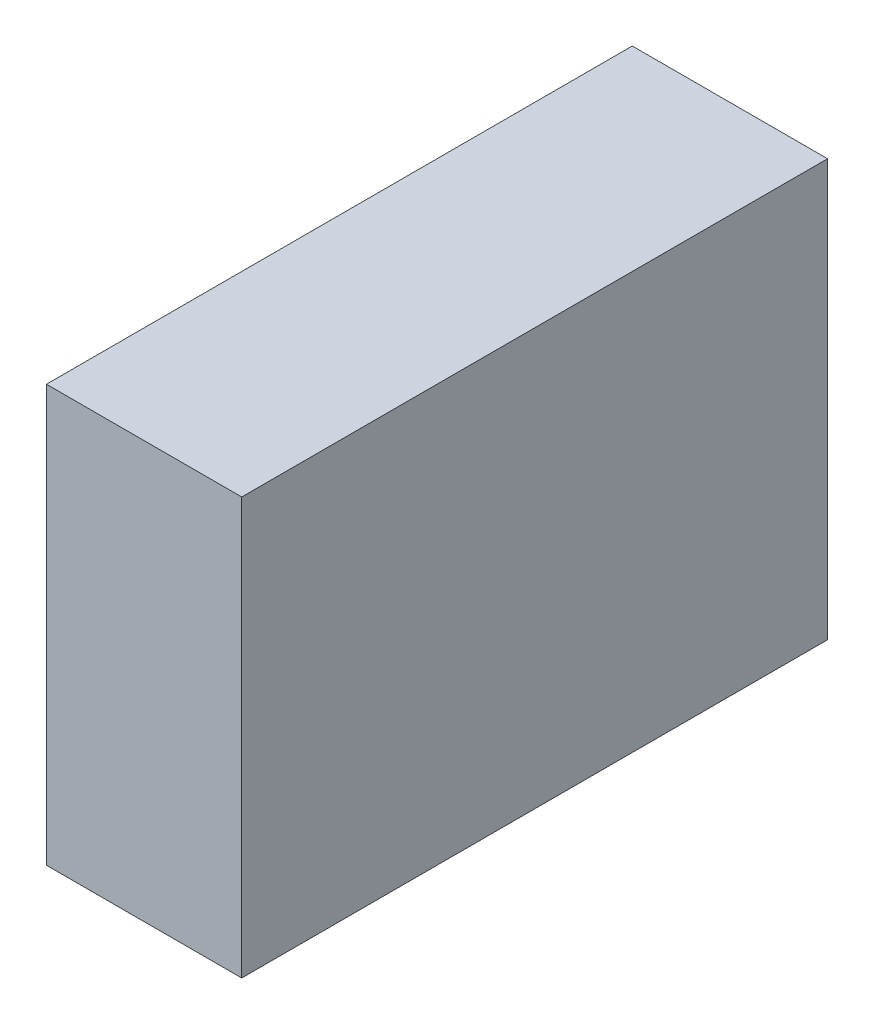
ISO-10303-21;
HEADER;
FILE_DESCRIPTION(('STEP AP214'),'2;1');
FILE_NAME('part.step','',(''),(''),'','','');
FILE_SCHEMA(('AUTOMOTIVE_DESIGN { 1 0 10303 214 1 1 1 1 }'));
ENDSEC;
DATA;
#1=APPLICATION_CONTEXT('core data for automotive mechanical design processes');
#2=APPLICATION_PROTOCOL_DEFINITION('international standard','automotive_design',2000,#1);
#3=PRODUCT_CONTEXT('',#1,'mechanical');
#4=PRODUCT('Part','Part','',(#3));
#5=PRODUCT_RELATED_PRODUCT_CATEGORY('part','',(#4));
#6=PRODUCT_DEFINITION_FORMATION('','',#4);
#7=PRODUCT_DEFINITION_CONTEXT('part definition',#1,'design');
#8=PRODUCT_DEFINITION('design','',#6,#7);
#9=PRODUCT_DEFINITION_SHAPE('','',#8);
#10=(LENGTH_UNIT() NAMED_UNIT(*) SI_UNIT(.MILLI.,.METRE.));
#11=(NAMED_UNIT(*) PLANE_ANGLE_UNIT() SI_UNIT($,.RADIAN.));
#12=(NAMED_UNIT(*) SI_UNIT($,.STERADIAN.) SOLID_ANGLE_UNIT());
#13=UNCERTAINTY_MEASURE_WITH_UNIT(LENGTH_MEASURE(1.E-05),#10,'distance_accuracy_value','');
#14=(GEOMETRIC_REPRESENTATION_CONTEXT(3) GLOBAL_UNCERTAINTY_ASSIGNED_CONTEXT((#13)) GLOBAL_UNIT_ASSIGNED_CONTEXT((#10,
#11,#12)) REPRESENTATION_CONTEXT('',''));
#15=CARTESIAN_POINT('',(0.,0.,0.));
#16=DIRECTION('',(0.,0.,1.));
#17=DIRECTION('',(1.,0.,0.));
#18=AXIS2_PLACEMENT_3D('',#15,#16,#17);
#19=CARTESIAN_POINT('',(15.,-16.,-22.5));
#20=DIRECTION('',(0.,0.,1.));
#21=DIRECTION('',(1.,0.,0.));
#22=AXIS2_PLACEMENT_3D('',#19,#20,#21);
#23=PLANE('',#22);
#24=DIRECTION('',(0.,1.,0.));
#25=VECTOR('',#24,1.);
#26=CARTESIAN_POINT('',(0.,-16.,-22.5));
#27=LINE('',#26,#25);
#28=CARTESIAN_POINT('',(0.,-16.,-22.5));
#29=VERTEX_POINT('',#28);
#30=CARTESIAN_POINT('',(0.,16.,-22.5));
#31=VERTEX_POINT('',#30);
#32=EDGE_CURVE('E111',#29,#31,#27,.T.);
#33=ORIENTED_EDGE('',*,*,#32,.T.);
#34=DIRECTION('',(-1.,0.,0.));
#35=VECTOR('',#34,1.);
#36=CARTESIAN_POINT('',(15.,16.,-22.5));
#37=LINE('',#36,#35);
#38=CARTESIAN_POINT('',(15.,16.,-22.5));
#39=VERTEX_POINT('',#38);
#40=EDGE_CURVE('E11',#39,#31,#37,.T.);
#41=ORIENTED_EDGE('',*,*,#40,.F.);
#42=DIRECTION('',(0.,1.,0.));
#43=VECTOR('',#42,1.);
#44=CARTESIAN_POINT('',(15.,-16.,-22.5));
#45=LINE('',#44,#43);
#46=CARTESIAN_POINT('',(15.,-16.,-22.5));
#47=VERTEX_POINT('',#46);
#48=EDGE_CURVE('E95',#47,#39,#45,.T.);
#49=ORIENTED_EDGE('',*,*,#48,.F.);
#50=DIRECTION('',(-1.,0.,0.));
#51=VECTOR('',#50,1.);
#52=CARTESIAN_POINT('',(15.,-16.,-22.5));
#53=LINE('',#52,#51);
#54=EDGE_CURVE('E107',#47,#29,#53,.T.);
#55=ORIENTED_EDGE('',*,*,#54,.T.);
#56=EDGE_LOOP('',(#33,#41,#49,#55));
#57=FACE_BOUND('',#56,.T.);
#58=ADVANCED_FACE('F43',(#57),#23,.F.);
#59=CARTESIAN_POINT('',(15.,16.,22.5));
#60=DIRECTION('',(0.,-1.,0.));
#61=DIRECTION('',(0.,0.,-1.));
#62=AXIS2_PLACEMENT_3D('',#59,#60,#61);
#63=PLANE('',#62);
#64=DIRECTION('',(0.,0.,1.));
#65=VECTOR('',#64,1.);
#66=CARTESIAN_POINT('',(0.,16.,22.5));
#67=LINE('',#66,#65);
#68=CARTESIAN_POINT('',(0.,16.,22.5));
#69=VERTEX_POINT('',#68);
#70=EDGE_CURVE('E100',#31,#69,#67,.T.);
#71=ORIENTED_EDGE('',*,*,#70,.T.);
#72=DIRECTION('',(-1.,0.,0.));
#73=VECTOR('',#72,1.);
#74=CARTESIAN_POINT('',(15.,16.,22.5));
#75=LINE('',#74,#73);
#76=CARTESIAN_POINT('',(15.,16.,22.5));
#77=VERTEX_POINT('',#76);
#78=EDGE_CURVE('E52',#77,#69,#75,.T.);
#79=ORIENTED_EDGE('',*,*,#78,.F.);
#80=DIRECTION('',(0.,0.,1.));
#81=VECTOR('',#80,1.);
#82=CARTESIAN_POINT('',(15.,16.,22.5));
#83=LINE('',#82,#81);
#84=EDGE_CURVE('E90',#39,#77,#83,.T.);
#85=ORIENTED_EDGE('',*,*,#84,.F.);
#86=ORIENTED_EDGE('',*,*,#40,.T.);
#87=EDGE_LOOP('',(#71,#79,#85,#86));
#88=FACE_BOUND('',#87,.T.);
#89=ADVANCED_FACE('F99',(#88),#63,.F.);
#90=CARTESIAN_POINT('',(15.,-16.,22.5));
#91=DIRECTION('',(0.,0.,-1.));
#92=DIRECTION('',(-1.,0.,0.));
#93=AXIS2_PLACEMENT_3D('',#90,#91,#92);
#94=PLANE('',#93);
#95=DIRECTION('',(0.,-1.,0.));
#96=VECTOR('',#95,1.);
#97=CARTESIAN_POINT('',(0.,-16.,22.5));
#98=LINE('',#97,#96);
#99=CARTESIAN_POINT('',(0.,-16.,22.5));
#100=VERTEX_POINT('',#99);
#101=EDGE_CURVE('E77',#69,#100,#98,.T.);
#102=ORIENTED_EDGE('',*,*,#101,.T.);
#103=DIRECTION('',(-1.,0.,0.));
#104=VECTOR('',#103,1.);
#105=CARTESIAN_POINT('',(15.,-16.,22.5));
#106=LINE('',#105,#104);
#107=CARTESIAN_POINT('',(15.,-16.,22.5));
#108=VERTEX_POINT('',#107);
#109=EDGE_CURVE('E102',#108,#100,#106,.T.);
#110=ORIENTED_EDGE('',*,*,#109,.F.);
#111=DIRECTION('',(0.,-1.,0.));
#112=VECTOR('',#111,1.);
#113=CARTESIAN_POINT('',(15.,-16.,22.5));
#114=LINE('',#113,#112);
#115=EDGE_CURVE('E93',#77,#108,#114,.T.);
#116=ORIENTED_EDGE('',*,*,#115,.F.);
#117=ORIENTED_EDGE('',*,*,#78,.T.);
#118=EDGE_LOOP('',(#102,#110,#116,#117));
#119=FACE_BOUND('',#118,.T.);
#120=ADVANCED_FACE('F103',(#119),#94,.F.);
#121=CARTESIAN_POINT('',(15.,-16.,22.5));
#122=DIRECTION('',(0.,1.,0.));
#123=DIRECTION('',(0.,0.,1.));
#124=AXIS2_PLACEMENT_3D('',#121,#122,#123);
#125=PLANE('',#124);
#126=DIRECTION('',(0.,0.,-1.));
#127=VECTOR('',#126,1.);
#128=CARTESIAN_POINT('',(0.,-16.,22.5));
#129=LINE('',#128,#127);
#130=EDGE_CURVE('E83',#100,#29,#129,.T.);
#131=ORIENTED_EDGE('',*,*,#130,.T.);
#132=ORIENTED_EDGE('',*,*,#54,.F.);
#133=DIRECTION('',(0.,0.,-1.));
#134=VECTOR('',#133,1.);
#135=CARTESIAN_POINT('',(15.,-16.,22.5));
#136=LINE('',#135,#134);
#137=EDGE_CURVE('E60',#108,#47,#136,.T.);
#138=ORIENTED_EDGE('',*,*,#137,.F.);
#139=ORIENTED_EDGE('',*,*,#109,.T.);
#140=EDGE_LOOP('',(#131,#132,#138,#139));
#141=FACE_BOUND('',#140,.T.);
#142=ADVANCED_FACE('F124',(#141),#125,.F.);
#143=CARTESIAN_POINT('',(15.,0.,0.));
#144=DIRECTION('',(-1.,0.,0.));
#145=DIRECTION('',(0.,0.,1.));
#146=AXIS2_PLACEMENT_3D('',#143,#144,#145);
#147=PLANE('',#146);
#148=ORIENTED_EDGE('',*,*,#48,.T.);
#149=ORIENTED_EDGE('',*,*,#84,.T.);
#150=ORIENTED_EDGE('',*,*,#115,.T.);
#151=ORIENTED_EDGE('',*,*,#137,.T.);
#152=EDGE_LOOP('',(#148,#149,#150,#151));
#153=FACE_BOUND('',#152,.T.);
#154=ADVANCED_FACE('F91',(#153),#147,.F.);
#155=CARTESIAN_POINT('',(0.,0.,0.));
#156=DIRECTION('',(-1.,0.,0.));
#157=DIRECTION('',(0.,0.,1.));
#158=AXIS2_PLACEMENT_3D('',#155,#156,#157);
#159=PLANE('',#158);
#160=ORIENTED_EDGE('',*,*,#32,.F.);
#161=ORIENTED_EDGE('',*,*,#130,.F.);
#162=ORIENTED_EDGE('',*,*,#101,.F.);
#163=ORIENTED_EDGE('',*,*,#70,.F.);
#164=EDGE_LOOP('',(#160,#161,#162,#163));
#165=FACE_BOUND('',#164,.T.);
#166=ADVANCED_FACE('F127',(#165),#159,.T.);
#167=CLOSED_SHELL('',(#58,#89,#120,#142,#154,#166));
#168=MANIFOLD_SOLID_BREP('B2',#167);
#169=ADVANCED_BREP_SHAPE_REPRESENTATION('',(#18,#168),#14);
#170=SHAPE_DEFINITION_REPRESENTATION(#9,#169);
ENDSEC;
END-ISO-10303-21;
